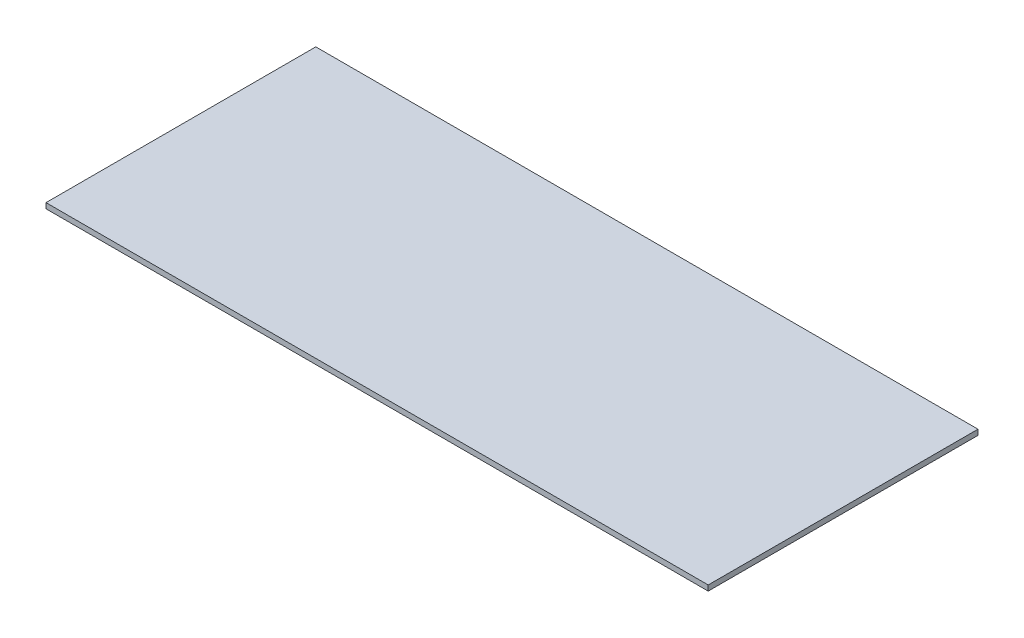
ISO-10303-21;
HEADER;
FILE_DESCRIPTION(('STEP AP214'),'2;1');
FILE_NAME('part.step','',(''),(''),'','','');
FILE_SCHEMA(('AUTOMOTIVE_DESIGN { 1 0 10303 214 1 1 1 1 }'));
ENDSEC;
DATA;
#1=APPLICATION_CONTEXT('core data for automotive mechanical design processes');
#2=APPLICATION_PROTOCOL_DEFINITION('international standard','automotive_design',2000,#1);
#3=PRODUCT_CONTEXT('',#1,'mechanical');
#4=PRODUCT('Part','Part','',(#3));
#5=PRODUCT_RELATED_PRODUCT_CATEGORY('part','',(#4));
#6=PRODUCT_DEFINITION_FORMATION('','',#4);
#7=PRODUCT_DEFINITION_CONTEXT('part definition',#1,'design');
#8=PRODUCT_DEFINITION('design','',#6,#7);
#9=PRODUCT_DEFINITION_SHAPE('','',#8);
#10=(LENGTH_UNIT() NAMED_UNIT(*) SI_UNIT(.MILLI.,.METRE.));
#11=(NAMED_UNIT(*) PLANE_ANGLE_UNIT() SI_UNIT($,.RADIAN.));
#12=(NAMED_UNIT(*) SI_UNIT($,.STERADIAN.) SOLID_ANGLE_UNIT());
#13=UNCERTAINTY_MEASURE_WITH_UNIT(LENGTH_MEASURE(1.E-05),#10,'distance_accuracy_value','');
#14=(GEOMETRIC_REPRESENTATION_CONTEXT(3) GLOBAL_UNCERTAINTY_ASSIGNED_CONTEXT((#13)) GLOBAL_UNIT_ASSIGNED_CONTEXT((#10,
#11,#12)) REPRESENTATION_CONTEXT('',''));
#15=CARTESIAN_POINT('',(0.,0.,0.));
#16=DIRECTION('',(0.,0.,1.));
#17=DIRECTION('',(1.,0.,0.));
#18=AXIS2_PLACEMENT_3D('',#15,#16,#17);
#19=CARTESIAN_POINT('',(342.9,5.55625,139.7));
#20=DIRECTION('',(-1.,0.,0.));
#21=DIRECTION('',(0.,0.,1.));
#22=AXIS2_PLACEMENT_3D('',#19,#20,#21);
#23=PLANE('',#22);
#24=DIRECTION('',(0.,0.,-1.));
#25=VECTOR('',#24,1.);
#26=CARTESIAN_POINT('',(342.9,0.,139.7));
#27=LINE('',#26,#25);
#28=CARTESIAN_POINT('',(342.9,0.,139.7));
#29=VERTEX_POINT('',#28);
#30=CARTESIAN_POINT('',(342.9,0.,-139.7));
#31=VERTEX_POINT('',#30);
#32=EDGE_CURVE('E110',#29,#31,#27,.T.);
#33=ORIENTED_EDGE('',*,*,#32,.T.);
#34=DIRECTION('',(0.,-1.,0.));
#35=VECTOR('',#34,1.);
#36=CARTESIAN_POINT('',(342.9,5.55625,-139.7));
#37=LINE('',#36,#35);
#38=CARTESIAN_POINT('',(342.9,5.55625,-139.7));
#39=VERTEX_POINT('',#38);
#40=EDGE_CURVE('E11',#39,#31,#37,.T.);
#41=ORIENTED_EDGE('',*,*,#40,.F.);
#42=DIRECTION('',(0.,0.,-1.));
#43=VECTOR('',#42,1.);
#44=CARTESIAN_POINT('',(342.9,5.55625,139.7));
#45=LINE('',#44,#43);
#46=CARTESIAN_POINT('',(342.9,5.55625,139.7));
#47=VERTEX_POINT('',#46);
#48=EDGE_CURVE('E93',#47,#39,#45,.T.);
#49=ORIENTED_EDGE('',*,*,#48,.F.);
#50=DIRECTION('',(0.,-1.,0.));
#51=VECTOR('',#50,1.);
#52=CARTESIAN_POINT('',(342.9,5.55625,139.7));
#53=LINE('',#52,#51);
#54=EDGE_CURVE('E106',#47,#29,#53,.T.);
#55=ORIENTED_EDGE('',*,*,#54,.T.);
#56=EDGE_LOOP('',(#33,#41,#49,#55));
#57=FACE_BOUND('',#56,.T.);
#58=ADVANCED_FACE('F41',(#57),#23,.F.);
#59=CARTESIAN_POINT('',(-342.9,5.55625,-139.7));
#60=DIRECTION('',(0.,0.,1.));
#61=DIRECTION('',(1.,0.,0.));
#62=AXIS2_PLACEMENT_3D('',#59,#60,#61);
#63=PLANE('',#62);
#64=DIRECTION('',(-1.,0.,0.));
#65=VECTOR('',#64,1.);
#66=CARTESIAN_POINT('',(-342.9,0.,-139.7));
#67=LINE('',#66,#65);
#68=CARTESIAN_POINT('',(-342.9,0.,-139.7));
#69=VERTEX_POINT('',#68);
#70=EDGE_CURVE('E98',#31,#69,#67,.T.);
#71=ORIENTED_EDGE('',*,*,#70,.T.);
#72=DIRECTION('',(0.,-1.,0.));
#73=VECTOR('',#72,1.);
#74=CARTESIAN_POINT('',(-342.9,5.55625,-139.7));
#75=LINE('',#74,#73);
#76=CARTESIAN_POINT('',(-342.9,5.55625,-139.7));
#77=VERTEX_POINT('',#76);
#78=EDGE_CURVE('E50',#77,#69,#75,.T.);
#79=ORIENTED_EDGE('',*,*,#78,.F.);
#80=DIRECTION('',(-1.,0.,0.));
#81=VECTOR('',#80,1.);
#82=CARTESIAN_POINT('',(-342.9,5.55625,-139.7));
#83=LINE('',#82,#81);
#84=EDGE_CURVE('E88',#39,#77,#83,.T.);
#85=ORIENTED_EDGE('',*,*,#84,.F.);
#86=ORIENTED_EDGE('',*,*,#40,.T.);
#87=EDGE_LOOP('',(#71,#79,#85,#86));
#88=FACE_BOUND('',#87,.T.);
#89=ADVANCED_FACE('F97',(#88),#63,.F.);
#90=CARTESIAN_POINT('',(-342.9,5.55625,139.7));
#91=DIRECTION('',(1.,0.,0.));
#92=DIRECTION('',(0.,0.,-1.));
#93=AXIS2_PLACEMENT_3D('',#90,#91,#92);
#94=PLANE('',#93);
#95=DIRECTION('',(0.,0.,1.));
#96=VECTOR('',#95,1.);
#97=CARTESIAN_POINT('',(-342.9,0.,139.7));
#98=LINE('',#97,#96);
#99=CARTESIAN_POINT('',(-342.9,0.,139.7));
#100=VERTEX_POINT('',#99);
#101=EDGE_CURVE('E75',#69,#100,#98,.T.);
#102=ORIENTED_EDGE('',*,*,#101,.T.);
#103=DIRECTION('',(0.,-1.,0.));
#104=VECTOR('',#103,1.);
#105=CARTESIAN_POINT('',(-342.9,5.55625,139.7));
#106=LINE('',#105,#104);
#107=CARTESIAN_POINT('',(-342.9,5.55625,139.7));
#108=VERTEX_POINT('',#107);
#109=EDGE_CURVE('E100',#108,#100,#106,.T.);
#110=ORIENTED_EDGE('',*,*,#109,.F.);
#111=DIRECTION('',(0.,0.,1.));
#112=VECTOR('',#111,1.);
#113=CARTESIAN_POINT('',(-342.9,5.55625,139.7));
#114=LINE('',#113,#112);
#115=EDGE_CURVE('E91',#77,#108,#114,.T.);
#116=ORIENTED_EDGE('',*,*,#115,.F.);
#117=ORIENTED_EDGE('',*,*,#78,.T.);
#118=EDGE_LOOP('',(#102,#110,#116,#117));
#119=FACE_BOUND('',#118,.T.);
#120=ADVANCED_FACE('F101',(#119),#94,.F.);
#121=CARTESIAN_POINT('',(-342.9,5.55625,139.7));
#122=DIRECTION('',(0.,0.,-1.));
#123=DIRECTION('',(-1.,0.,0.));
#124=AXIS2_PLACEMENT_3D('',#121,#122,#123);
#125=PLANE('',#124);
#126=DIRECTION('',(1.,0.,0.));
#127=VECTOR('',#126,1.);
#128=CARTESIAN_POINT('',(-342.9,0.,139.7));
#129=LINE('',#128,#127);
#130=EDGE_CURVE('E81',#100,#29,#129,.T.);
#131=ORIENTED_EDGE('',*,*,#130,.T.);
#132=ORIENTED_EDGE('',*,*,#54,.F.);
#133=DIRECTION('',(1.,0.,0.));
#134=VECTOR('',#133,1.);
#135=CARTESIAN_POINT('',(-342.9,5.55625,139.7));
#136=LINE('',#135,#134);
#137=EDGE_CURVE('E58',#108,#47,#136,.T.);
#138=ORIENTED_EDGE('',*,*,#137,.F.);
#139=ORIENTED_EDGE('',*,*,#109,.T.);
#140=EDGE_LOOP('',(#131,#132,#138,#139));
#141=FACE_BOUND('',#140,.T.);
#142=ADVANCED_FACE('F124',(#141),#125,.F.);
#143=CARTESIAN_POINT('',(0.,5.55625,0.));
#144=DIRECTION('',(0.,-1.,0.));
#145=DIRECTION('',(0.,0.,-1.));
#146=AXIS2_PLACEMENT_3D('',#143,#144,#145);
#147=PLANE('',#146);
#148=ORIENTED_EDGE('',*,*,#48,.T.);
#149=ORIENTED_EDGE('',*,*,#84,.T.);
#150=ORIENTED_EDGE('',*,*,#115,.T.);
#151=ORIENTED_EDGE('',*,*,#137,.T.);
#152=EDGE_LOOP('',(#148,#149,#150,#151));
#153=FACE_BOUND('',#152,.T.);
#154=ADVANCED_FACE('F89',(#153),#147,.F.);
#155=CARTESIAN_POINT('',(0.,0.,0.));
#156=DIRECTION('',(0.,-1.,0.));
#157=DIRECTION('',(0.,0.,-1.));
#158=AXIS2_PLACEMENT_3D('',#155,#156,#157);
#159=PLANE('',#158);
#160=ORIENTED_EDGE('',*,*,#32,.F.);
#161=ORIENTED_EDGE('',*,*,#130,.F.);
#162=ORIENTED_EDGE('',*,*,#101,.F.);
#163=ORIENTED_EDGE('',*,*,#70,.F.);
#164=EDGE_LOOP('',(#160,#161,#162,#163));
#165=FACE_BOUND('',#164,.T.);
#166=ADVANCED_FACE('F127',(#165),#159,.T.);
#167=CLOSED_SHELL('',(#58,#89,#120,#142,#154,#166));
#168=MANIFOLD_SOLID_BREP('B2',#167);
#169=ADVANCED_BREP_SHAPE_REPRESENTATION('',(#18,#168),#14);
#170=SHAPE_DEFINITION_REPRESENTATION(#9,#169);
ENDSEC;
END-ISO-10303-21;
